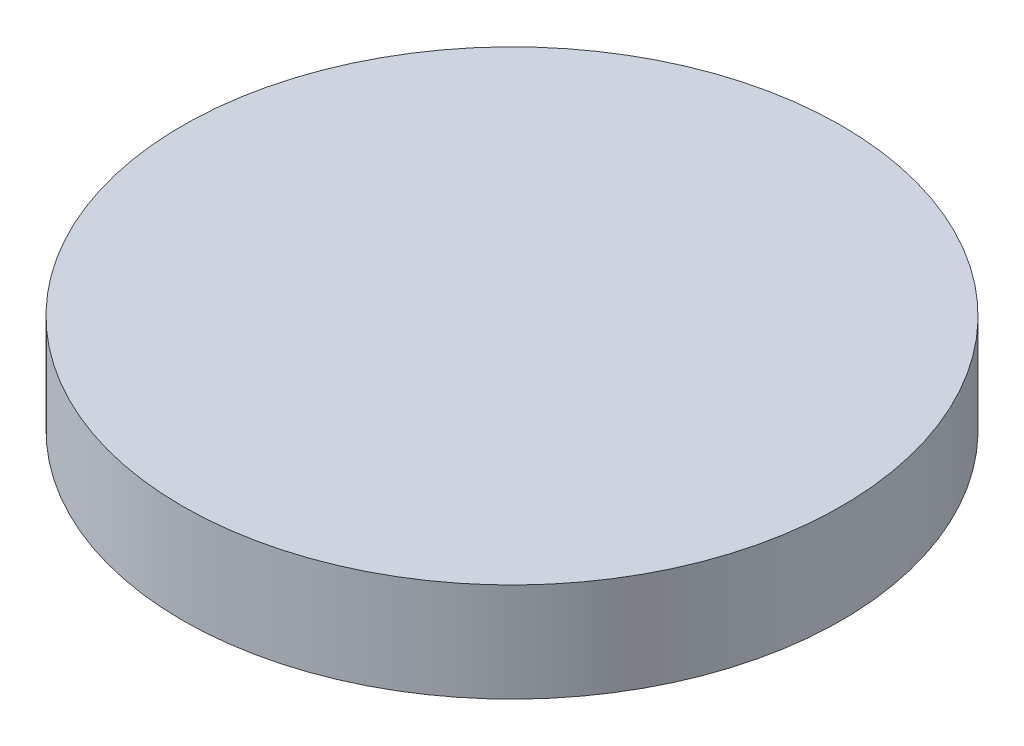
ISO-10303-21;
HEADER;
FILE_DESCRIPTION(('STEP AP214'),'2;1');
FILE_NAME('part.step','',(''),(''),'','','');
FILE_SCHEMA(('AUTOMOTIVE_DESIGN { 1 0 10303 214 1 1 1 1 }'));
ENDSEC;
DATA;
#1=APPLICATION_CONTEXT('core data for automotive mechanical design processes');
#2=APPLICATION_PROTOCOL_DEFINITION('international standard','automotive_design',2000,#1);
#3=PRODUCT_CONTEXT('',#1,'mechanical');
#4=PRODUCT('Part','Part','',(#3));
#5=PRODUCT_RELATED_PRODUCT_CATEGORY('part','',(#4));
#6=PRODUCT_DEFINITION_FORMATION('','',#4);
#7=PRODUCT_DEFINITION_CONTEXT('part definition',#1,'design');
#8=PRODUCT_DEFINITION('design','',#6,#7);
#9=PRODUCT_DEFINITION_SHAPE('','',#8);
#10=(LENGTH_UNIT() NAMED_UNIT(*) SI_UNIT(.MILLI.,.METRE.));
#11=(NAMED_UNIT(*) PLANE_ANGLE_UNIT() SI_UNIT($,.RADIAN.));
#12=(NAMED_UNIT(*) SI_UNIT($,.STERADIAN.) SOLID_ANGLE_UNIT());
#13=UNCERTAINTY_MEASURE_WITH_UNIT(LENGTH_MEASURE(1.E-05),#10,'distance_accuracy_value','');
#14=(GEOMETRIC_REPRESENTATION_CONTEXT(3) GLOBAL_UNCERTAINTY_ASSIGNED_CONTEXT((#13)) GLOBAL_UNIT_ASSIGNED_CONTEXT((#10,
#11,#12)) REPRESENTATION_CONTEXT('',''));
#15=CARTESIAN_POINT('',(0.,0.,0.));
#16=DIRECTION('',(0.,0.,1.));
#17=DIRECTION('',(1.,0.,0.));
#18=AXIS2_PLACEMENT_3D('',#15,#16,#17);
#19=CARTESIAN_POINT('',(0.,5.81153935626191,0.));
#20=DIRECTION('',(0.,-1.,0.));
#21=DIRECTION('',(0.,0.,-1.));
#22=AXIS2_PLACEMENT_3D('',#19,#20,#21);
#23=CYLINDRICAL_SURFACE('',#22,12.7);
#24=CARTESIAN_POINT('',(0.,5.81153935626191,0.));
#25=DIRECTION('',(0.,1.,0.));
#26=DIRECTION('',(0.,0.,1.));
#27=AXIS2_PLACEMENT_3D('',#24,#25,#26);
#28=CIRCLE('',#27,12.7);
#29=CARTESIAN_POINT('',(0.,5.81153935626191,12.7));
#30=VERTEX_POINT('',#29);
#31=EDGE_CURVE('E10',#30,#30,#28,.T.);
#32=ORIENTED_EDGE('',*,*,#31,.F.);
#33=EDGE_LOOP('',(#32));
#34=FACE_BOUND('',#33,.T.);
#35=CARTESIAN_POINT('',(0.,2.00153935626191,0.));
#36=DIRECTION('',(0.,1.,0.));
#37=DIRECTION('',(0.,0.,1.));
#38=AXIS2_PLACEMENT_3D('',#35,#36,#37);
#39=CIRCLE('',#38,12.7);
#40=CARTESIAN_POINT('',(0.,2.00153935626191,12.7));
#41=VERTEX_POINT('',#40);
#42=EDGE_CURVE('E44',#41,#41,#39,.T.);
#43=ORIENTED_EDGE('',*,*,#42,.T.);
#44=EDGE_LOOP('',(#43));
#45=FACE_BOUND('',#44,.T.);
#46=ADVANCED_FACE('F41',(#34,#45),#23,.T.);
#47=CARTESIAN_POINT('',(0.,5.81153935626191,0.));
#48=DIRECTION('',(0.,1.,0.));
#49=DIRECTION('',(0.,0.,1.));
#50=AXIS2_PLACEMENT_3D('',#47,#48,#49);
#51=PLANE('',#50);
#52=ORIENTED_EDGE('',*,*,#31,.T.);
#53=EDGE_LOOP('',(#52));
#54=FACE_BOUND('',#53,.T.);
#55=ADVANCED_FACE('F123',(#54),#51,.T.);
#56=CARTESIAN_POINT('',(0.,2.00153935626191,0.));
#57=DIRECTION('',(0.,1.,0.));
#58=DIRECTION('',(0.,0.,1.));
#59=AXIS2_PLACEMENT_3D('',#56,#57,#58);
#60=PLANE('',#59);
#61=CARTESIAN_POINT('',(0.,2.00153935626191,0.));
#62=DIRECTION('',(0.,1.,0.));
#63=DIRECTION('',(0.,0.,1.));
#64=AXIS2_PLACEMENT_3D('',#61,#62,#63);
#65=CIRCLE('',#64,2.413);
#66=CARTESIAN_POINT('',(0.,2.00153935626191,-2.413));
#67=VERTEX_POINT('',#66);
#68=EDGE_CURVE('E103',#67,#67,#65,.T.);
#69=ORIENTED_EDGE('',*,*,#68,.T.);
#70=EDGE_LOOP('',(#69));
#71=FACE_BOUND('',#70,.T.);
#72=CARTESIAN_POINT('',(-7.69896583964361,2.00153935626191,-4.44500000000009));
#73=DIRECTION('',(0.,1.,0.));
#74=DIRECTION('',(0.866025403784433,0.,0.50000000000001));
#75=AXIS2_PLACEMENT_3D('',#72,#73,#74);
#76=CIRCLE('',#75,2.413);
#77=CARTESIAN_POINT('',(-7.69896583964361,2.00153935626191,-6.85800000000009));
#78=VERTEX_POINT('',#77);
#79=EDGE_CURVE('E71',#78,#78,#76,.T.);
#80=ORIENTED_EDGE('',*,*,#79,.T.);
#81=EDGE_LOOP('',(#80));
#82=FACE_BOUND('',#81,.T.);
#83=CARTESIAN_POINT('',(-7.6989658396437,2.00153935626191,4.44499999999993));
#84=DIRECTION('',(0.,1.,0.));
#85=DIRECTION('',(0.866025403784443,0.,-0.499999999999992));
#86=AXIS2_PLACEMENT_3D('',#83,#84,#85);
#87=CIRCLE('',#86,2.413);
#88=CARTESIAN_POINT('',(-7.6989658396437,2.00153935626191,2.03199999999993));
#89=VERTEX_POINT('',#88);
#90=EDGE_CURVE('E80',#89,#89,#87,.T.);
#91=ORIENTED_EDGE('',*,*,#90,.T.);
#92=EDGE_LOOP('',(#91));
#93=FACE_BOUND('',#92,.T.);
#94=CARTESIAN_POINT('',(0.,2.00153935626191,8.89));
#95=DIRECTION('',(0.,1.,0.));
#96=DIRECTION('',(0.,0.,-1.));
#97=AXIS2_PLACEMENT_3D('',#94,#95,#96);
#98=CIRCLE('',#97,2.413);
#99=CARTESIAN_POINT('',(0.,2.00153935626191,6.477));
#100=VERTEX_POINT('',#99);
#101=EDGE_CURVE('E88',#100,#100,#98,.T.);
#102=ORIENTED_EDGE('',*,*,#101,.T.);
#103=EDGE_LOOP('',(#102));
#104=FACE_BOUND('',#103,.T.);
#105=CARTESIAN_POINT('',(7.69896583964364,2.00153935626191,4.44500000000004));
#106=DIRECTION('',(0.,1.,0.));
#107=DIRECTION('',(-0.866025403784436,0.,-0.500000000000004));
#108=AXIS2_PLACEMENT_3D('',#105,#106,#107);
#109=CIRCLE('',#108,2.413);
#110=CARTESIAN_POINT('',(7.69896583964364,2.00153935626191,2.03200000000004));
#111=VERTEX_POINT('',#110);
#112=EDGE_CURVE('E96',#111,#111,#109,.T.);
#113=ORIENTED_EDGE('',*,*,#112,.T.);
#114=EDGE_LOOP('',(#113));
#115=FACE_BOUND('',#114,.T.);
#116=CARTESIAN_POINT('',(7.69896583964367,2.00153935626191,-4.44499999999998));
#117=DIRECTION('',(0.,1.,0.));
#118=DIRECTION('',(-0.86602540378444,0.,0.499999999999998));
#119=AXIS2_PLACEMENT_3D('',#116,#117,#118);
#120=CIRCLE('',#119,2.413);
#121=CARTESIAN_POINT('',(7.69896583964367,2.00153935626191,-6.85799999999998));
#122=VERTEX_POINT('',#121);
#123=EDGE_CURVE('E63',#122,#122,#120,.T.);
#124=ORIENTED_EDGE('',*,*,#123,.T.);
#125=EDGE_LOOP('',(#124));
#126=FACE_BOUND('',#125,.T.);
#127=CARTESIAN_POINT('',(0.,2.00153935626191,-8.89));
#128=DIRECTION('',(0.,1.,0.));
#129=DIRECTION('',(0.,0.,1.));
#130=AXIS2_PLACEMENT_3D('',#127,#128,#129);
#131=CIRCLE('',#130,2.413);
#132=CARTESIAN_POINT('',(0.,2.00153935626191,-11.303));
#133=VERTEX_POINT('',#132);
#134=EDGE_CURVE('E55',#133,#133,#131,.T.);
#135=ORIENTED_EDGE('',*,*,#134,.T.);
#136=EDGE_LOOP('',(#135));
#137=FACE_BOUND('',#136,.T.);
#138=ORIENTED_EDGE('',*,*,#42,.F.);
#139=EDGE_LOOP('',(#138));
#140=FACE_BOUND('',#139,.T.);
#141=ADVANCED_FACE('F128',(#71,#82,#93,#104,#115,#126,#137,#140),#60,.F.);
#142=CARTESIAN_POINT('',(0.,5.04953935626191,-8.89));
#143=DIRECTION('',(0.,-1.,0.));
#144=DIRECTION('',(0.,0.,-1.));
#145=AXIS2_PLACEMENT_3D('',#142,#143,#144);
#146=CYLINDRICAL_SURFACE('',#145,2.413);
#147=CARTESIAN_POINT('',(0.,5.04953935626191,-8.89));
#148=DIRECTION('',(0.,1.,0.));
#149=DIRECTION('',(0.,0.,1.));
#150=AXIS2_PLACEMENT_3D('',#147,#148,#149);
#151=CIRCLE('',#150,2.413);
#152=CARTESIAN_POINT('',(0.,5.04953935626191,-11.303));
#153=VERTEX_POINT('',#152);
#154=EDGE_CURVE('E53',#153,#153,#151,.T.);
#155=CARTESIAN_POINT('',(0.,5.04953935626191,-11.303));
#156=CARTESIAN_POINT('',(0.,5.01778935626191,-11.303));
#157=CARTESIAN_POINT('',(0.,4.98603935626191,-11.303));
#158=CARTESIAN_POINT('',(0.,4.92253935626191,-11.303));
#159=CARTESIAN_POINT('',(0.,4.89078935626191,-11.303));
#160=CARTESIAN_POINT('',(0.,4.82728935626191,-11.303));
#161=CARTESIAN_POINT('',(0.,4.79553935626191,-11.303));
#162=CARTESIAN_POINT('',(0.,4.73203935626191,-11.303));
#163=CARTESIAN_POINT('',(0.,4.70028935626191,-11.303));
#164=CARTESIAN_POINT('',(0.,4.63678935626191,-11.303));
#165=CARTESIAN_POINT('',(0.,4.60503935626191,-11.303));
#166=CARTESIAN_POINT('',(0.,4.54153935626191,-11.303));
#167=CARTESIAN_POINT('',(0.,4.50978935626191,-11.303));
#168=CARTESIAN_POINT('',(0.,4.44628935626191,-11.303));
#169=CARTESIAN_POINT('',(0.,4.41453935626191,-11.303));
#170=CARTESIAN_POINT('',(0.,4.35103935626191,-11.303));
#171=CARTESIAN_POINT('',(0.,4.31928935626191,-11.303));
#172=CARTESIAN_POINT('',(0.,4.25578935626191,-11.303));
#173=CARTESIAN_POINT('',(0.,4.22403935626191,-11.303));
#174=CARTESIAN_POINT('',(0.,4.16053935626191,-11.303));
#175=CARTESIAN_POINT('',(0.,4.12878935626191,-11.303));
#176=CARTESIAN_POINT('',(0.,4.06528935626191,-11.303));
#177=CARTESIAN_POINT('',(0.,4.03353935626191,-11.303));
#178=CARTESIAN_POINT('',(0.,3.97003935626191,-11.303));
#179=CARTESIAN_POINT('',(0.,3.93828935626191,-11.303));
#180=CARTESIAN_POINT('',(0.,3.87478935626191,-11.303));
#181=CARTESIAN_POINT('',(0.,3.84303935626191,-11.303));
#182=CARTESIAN_POINT('',(0.,3.77953935626191,-11.303));
#183=CARTESIAN_POINT('',(0.,3.74778935626191,-11.303));
#184=CARTESIAN_POINT('',(0.,3.68428935626191,-11.303));
#185=CARTESIAN_POINT('',(0.,3.65253935626191,-11.303));
#186=CARTESIAN_POINT('',(0.,3.58903935626191,-11.303));
#187=CARTESIAN_POINT('',(0.,3.55728935626191,-11.303));
#188=CARTESIAN_POINT('',(0.,3.49378935626191,-11.303));
#189=CARTESIAN_POINT('',(0.,3.46203935626191,-11.303));
#190=CARTESIAN_POINT('',(0.,3.39853935626191,-11.303));
#191=CARTESIAN_POINT('',(0.,3.36678935626191,-11.303));
#192=CARTESIAN_POINT('',(0.,3.30328935626191,-11.303));
#193=CARTESIAN_POINT('',(0.,3.27153935626191,-11.303));
#194=CARTESIAN_POINT('',(0.,3.20803935626191,-11.303));
#195=CARTESIAN_POINT('',(0.,3.17628935626191,-11.303));
#196=CARTESIAN_POINT('',(0.,3.11278935626191,-11.303));
#197=CARTESIAN_POINT('',(0.,3.08103935626191,-11.303));
#198=CARTESIAN_POINT('',(0.,3.01753935626191,-11.303));
#199=CARTESIAN_POINT('',(0.,2.98578935626191,-11.303));
#200=CARTESIAN_POINT('',(0.,2.92228935626191,-11.303));
#201=CARTESIAN_POINT('',(0.,2.89053935626191,-11.303));
#202=CARTESIAN_POINT('',(0.,2.82703935626191,-11.303));
#203=CARTESIAN_POINT('',(0.,2.79528935626191,-11.303));
#204=CARTESIAN_POINT('',(0.,2.73178935626191,-11.303));
#205=CARTESIAN_POINT('',(0.,2.70003935626191,-11.303));
#206=CARTESIAN_POINT('',(0.,2.63653935626191,-11.303));
#207=CARTESIAN_POINT('',(0.,2.60478935626191,-11.303));
#208=CARTESIAN_POINT('',(0.,2.54128935626191,-11.303));
#209=CARTESIAN_POINT('',(0.,2.50953935626191,-11.303));
#210=CARTESIAN_POINT('',(0.,2.44603935626191,-11.303));
#211=CARTESIAN_POINT('',(0.,2.41428935626191,-11.303));
#212=CARTESIAN_POINT('',(0.,2.35078935626191,-11.303));
#213=CARTESIAN_POINT('',(0.,2.31903935626191,-11.303));
#214=CARTESIAN_POINT('',(0.,2.25553935626191,-11.303));
#215=CARTESIAN_POINT('',(0.,2.22378935626191,-11.303));
#216=CARTESIAN_POINT('',(0.,2.16028935626191,-11.303));
#217=CARTESIAN_POINT('',(0.,2.12853935626191,-11.303));
#218=CARTESIAN_POINT('',(0.,2.06503935626191,-11.303));
#219=CARTESIAN_POINT('',(0.,2.03328935626191,-11.303));
#220=CARTESIAN_POINT('',(0.,2.00153935626191,-11.303));
#221=B_SPLINE_CURVE_WITH_KNOTS('',3,(#155,#156,#157,#158,#159,#160,#161,#162,#163,#164,#165,
#166,#167,#168,#169,#170,#171,#172,#173,#174,#175,#176,#177,#178,#179,#180,#181,#182,#183,#184,
#185,#186,#187,#188,#189,#190,#191,#192,#193,#194,#195,#196,#197,#198,#199,#200,#201,#202,#203,
#204,#205,#206,#207,#208,#209,#210,#211,#212,#213,#214,#215,#216,#217,#218,#219,#220),
.UNSPECIFIED.,.F.,.F.,(4,2,2,2,2,2,2,2,2,2,2,2,2,2,2,2,2,2,2,2,2,2,2,2,2,2,2,2,2,2,2,2,4),(0.,
0.0952499999999998,0.1905,0.28575,0.380999999999999,0.476249999999999,0.571499999999999,0.66675,
0.762,0.85725,0.952499999999999,1.04775,1.143,1.23825,1.3335,1.42875,1.524,1.61925,1.7145,
1.80975,1.905,2.00025,2.0955,2.19075,2.286,2.38125,2.4765,2.57175,2.667,2.76225,2.8575,2.95275,
3.048),.UNSPECIFIED.);
#222=EDGE_CURVE('BSEAM134',#153,#133,#221,.T.);
#223=ORIENTED_EDGE('',*,*,#154,.T.);
#224=ORIENTED_EDGE('',*,*,#134,.F.);
#225=ORIENTED_EDGE('',*,*,#222,.T.);
#226=ORIENTED_EDGE('',*,*,#222,.F.);
#227=EDGE_LOOP('',(#223,#225,#224,#226));
#228=FACE_BOUND('',#227,.T.);
#229=ADVANCED_FACE('F134',(#228),#146,.F.);
#230=CARTESIAN_POINT('',(0.,5.04953935626191,-8.89));
#231=DIRECTION('',(0.,1.,0.));
#232=DIRECTION('',(0.,0.,1.));
#233=AXIS2_PLACEMENT_3D('',#230,#231,#232);
#234=PLANE('',#233);
#235=ORIENTED_EDGE('',*,*,#154,.F.);
#236=EDGE_LOOP('',(#235));
#237=FACE_BOUND('',#236,.T.);
#238=ADVANCED_FACE('F139',(#237),#234,.F.);
#239=CARTESIAN_POINT('',(7.69896583964367,5.04953935626191,-4.44499999999998));
#240=DIRECTION('',(0.,-1.,0.));
#241=DIRECTION('',(0.,0.,-1.));
#242=AXIS2_PLACEMENT_3D('',#239,#240,#241);
#243=CYLINDRICAL_SURFACE('',#242,2.413);
#244=CARTESIAN_POINT('',(7.69896583964367,5.04953935626191,-4.44499999999998));
#245=DIRECTION('',(0.,1.,0.));
#246=DIRECTION('',(-0.86602540378444,0.,0.499999999999998));
#247=AXIS2_PLACEMENT_3D('',#244,#245,#246);
#248=CIRCLE('',#247,2.413);
#249=CARTESIAN_POINT('',(7.69896583964367,5.04953935626191,-6.85799999999998));
#250=VERTEX_POINT('',#249);
#251=EDGE_CURVE('E59',#250,#250,#248,.T.);
#252=CARTESIAN_POINT('',(7.69896583964367,5.04953935626191,-6.85799999999998));
#253=CARTESIAN_POINT('',(7.69896583964367,5.01778935626191,-6.85799999999998));
#254=CARTESIAN_POINT('',(7.69896583964367,4.98603935626191,-6.85799999999998));
#255=CARTESIAN_POINT('',(7.69896583964367,4.92253935626191,-6.85799999999998));
#256=CARTESIAN_POINT('',(7.69896583964367,4.89078935626191,-6.85799999999998));
#257=CARTESIAN_POINT('',(7.69896583964367,4.82728935626191,-6.85799999999998));
#258=CARTESIAN_POINT('',(7.69896583964367,4.79553935626191,-6.85799999999998));
#259=CARTESIAN_POINT('',(7.69896583964367,4.73203935626191,-6.85799999999998));
#260=CARTESIAN_POINT('',(7.69896583964367,4.70028935626191,-6.85799999999998));
#261=CARTESIAN_POINT('',(7.69896583964367,4.63678935626191,-6.85799999999998));
#262=CARTESIAN_POINT('',(7.69896583964367,4.60503935626191,-6.85799999999998));
#263=CARTESIAN_POINT('',(7.69896583964367,4.54153935626191,-6.85799999999998));
#264=CARTESIAN_POINT('',(7.69896583964367,4.50978935626191,-6.85799999999998));
#265=CARTESIAN_POINT('',(7.69896583964367,4.44628935626191,-6.85799999999998));
#266=CARTESIAN_POINT('',(7.69896583964367,4.41453935626191,-6.85799999999998));
#267=CARTESIAN_POINT('',(7.69896583964367,4.35103935626191,-6.85799999999998));
#268=CARTESIAN_POINT('',(7.69896583964367,4.31928935626191,-6.85799999999998));
#269=CARTESIAN_POINT('',(7.69896583964367,4.25578935626191,-6.85799999999998));
#270=CARTESIAN_POINT('',(7.69896583964367,4.22403935626191,-6.85799999999998));
#271=CARTESIAN_POINT('',(7.69896583964367,4.16053935626191,-6.85799999999998));
#272=CARTESIAN_POINT('',(7.69896583964367,4.12878935626191,-6.85799999999998));
#273=CARTESIAN_POINT('',(7.69896583964367,4.06528935626191,-6.85799999999998));
#274=CARTESIAN_POINT('',(7.69896583964367,4.03353935626191,-6.85799999999998));
#275=CARTESIAN_POINT('',(7.69896583964367,3.97003935626191,-6.85799999999998));
#276=CARTESIAN_POINT('',(7.69896583964367,3.93828935626191,-6.85799999999998));
#277=CARTESIAN_POINT('',(7.69896583964367,3.87478935626191,-6.85799999999998));
#278=CARTESIAN_POINT('',(7.69896583964367,3.84303935626191,-6.85799999999998));
#279=CARTESIAN_POINT('',(7.69896583964367,3.77953935626191,-6.85799999999998));
#280=CARTESIAN_POINT('',(7.69896583964367,3.74778935626191,-6.85799999999998));
#281=CARTESIAN_POINT('',(7.69896583964367,3.68428935626191,-6.85799999999998));
#282=CARTESIAN_POINT('',(7.69896583964367,3.65253935626191,-6.85799999999998));
#283=CARTESIAN_POINT('',(7.69896583964367,3.58903935626191,-6.85799999999998));
#284=CARTESIAN_POINT('',(7.69896583964367,3.55728935626191,-6.85799999999998));
#285=CARTESIAN_POINT('',(7.69896583964367,3.49378935626191,-6.85799999999998));
#286=CARTESIAN_POINT('',(7.69896583964367,3.46203935626191,-6.85799999999998));
#287=CARTESIAN_POINT('',(7.69896583964367,3.39853935626191,-6.85799999999998));
#288=CARTESIAN_POINT('',(7.69896583964367,3.36678935626191,-6.85799999999998));
#289=CARTESIAN_POINT('',(7.69896583964367,3.30328935626191,-6.85799999999998));
#290=CARTESIAN_POINT('',(7.69896583964367,3.27153935626191,-6.85799999999998));
#291=CARTESIAN_POINT('',(7.69896583964367,3.20803935626191,-6.85799999999998));
#292=CARTESIAN_POINT('',(7.69896583964367,3.17628935626191,-6.85799999999998));
#293=CARTESIAN_POINT('',(7.69896583964367,3.11278935626191,-6.85799999999998));
#294=CARTESIAN_POINT('',(7.69896583964367,3.08103935626191,-6.85799999999998));
#295=CARTESIAN_POINT('',(7.69896583964367,3.01753935626191,-6.85799999999998));
#296=CARTESIAN_POINT('',(7.69896583964367,2.98578935626191,-6.85799999999998));
#297=CARTESIAN_POINT('',(7.69896583964367,2.92228935626191,-6.85799999999998));
#298=CARTESIAN_POINT('',(7.69896583964367,2.89053935626191,-6.85799999999998));
#299=CARTESIAN_POINT('',(7.69896583964367,2.82703935626191,-6.85799999999998));
#300=CARTESIAN_POINT('',(7.69896583964367,2.79528935626191,-6.85799999999998));
#301=CARTESIAN_POINT('',(7.69896583964367,2.73178935626191,-6.85799999999998));
#302=CARTESIAN_POINT('',(7.69896583964367,2.70003935626191,-6.85799999999998));
#303=CARTESIAN_POINT('',(7.69896583964367,2.63653935626191,-6.85799999999998));
#304=CARTESIAN_POINT('',(7.69896583964367,2.60478935626191,-6.85799999999998));
#305=CARTESIAN_POINT('',(7.69896583964367,2.54128935626191,-6.85799999999998));
#306=CARTESIAN_POINT('',(7.69896583964367,2.50953935626191,-6.85799999999998));
#307=CARTESIAN_POINT('',(7.69896583964367,2.44603935626191,-6.85799999999998));
#308=CARTESIAN_POINT('',(7.69896583964367,2.41428935626191,-6.85799999999998));
#309=CARTESIAN_POINT('',(7.69896583964367,2.35078935626191,-6.85799999999998));
#310=CARTESIAN_POINT('',(7.69896583964367,2.31903935626191,-6.85799999999998));
#311=CARTESIAN_POINT('',(7.69896583964367,2.25553935626191,-6.85799999999998));
#312=CARTESIAN_POINT('',(7.69896583964367,2.22378935626191,-6.85799999999998));
#313=CARTESIAN_POINT('',(7.69896583964367,2.16028935626191,-6.85799999999998));
#314=CARTESIAN_POINT('',(7.69896583964367,2.12853935626191,-6.85799999999998));
#315=CARTESIAN_POINT('',(7.69896583964367,2.06503935626191,-6.85799999999998));
#316=CARTESIAN_POINT('',(7.69896583964367,2.03328935626191,-6.85799999999998));
#317=CARTESIAN_POINT('',(7.69896583964367,2.00153935626191,-6.85799999999998));
#318=B_SPLINE_CURVE_WITH_KNOTS('',3,(#252,#253,#254,#255,#256,#257,#258,#259,#260,#261,#262,
#263,#264,#265,#266,#267,#268,#269,#270,#271,#272,#273,#274,#275,#276,#277,#278,#279,#280,#281,
#282,#283,#284,#285,#286,#287,#288,#289,#290,#291,#292,#293,#294,#295,#296,#297,#298,#299,#300,
#301,#302,#303,#304,#305,#306,#307,#308,#309,#310,#311,#312,#313,#314,#315,#316,#317),
.UNSPECIFIED.,.F.,.F.,(4,2,2,2,2,2,2,2,2,2,2,2,2,2,2,2,2,2,2,2,2,2,2,2,2,2,2,2,2,2,2,2,4),(0.,
0.0952499999999998,0.1905,0.28575,0.380999999999999,0.476249999999999,0.571499999999999,0.66675,
0.762,0.85725,0.952499999999999,1.04775,1.143,1.23825,1.3335,1.42875,1.524,1.61925,1.7145,
1.80975,1.905,2.00025,2.0955,2.19075,2.286,2.38125,2.4765,2.57175,2.667,2.76225,2.8575,2.95275,
3.048),.UNSPECIFIED.);
#319=EDGE_CURVE('BSEAM146',#250,#122,#318,.T.);
#320=ORIENTED_EDGE('',*,*,#251,.T.);
#321=ORIENTED_EDGE('',*,*,#123,.F.);
#322=ORIENTED_EDGE('',*,*,#319,.T.);
#323=ORIENTED_EDGE('',*,*,#319,.F.);
#324=EDGE_LOOP('',(#320,#322,#321,#323));
#325=FACE_BOUND('',#324,.T.);
#326=ADVANCED_FACE('F146',(#325),#243,.F.);
#327=CARTESIAN_POINT('',(7.69896583964367,5.04953935626191,-4.44499999999998));
#328=DIRECTION('',(0.,1.,0.));
#329=DIRECTION('',(-0.86602540378444,0.,0.499999999999998));
#330=AXIS2_PLACEMENT_3D('',#327,#328,#329);
#331=PLANE('',#330);
#332=ORIENTED_EDGE('',*,*,#251,.F.);
#333=EDGE_LOOP('',(#332));
#334=FACE_BOUND('',#333,.T.);
#335=ADVANCED_FACE('F150',(#334),#331,.F.);
#336=CARTESIAN_POINT('',(7.69896583964364,5.04953935626191,4.44500000000004));
#337=DIRECTION('',(0.,-1.,0.));
#338=DIRECTION('',(0.,0.,-1.));
#339=AXIS2_PLACEMENT_3D('',#336,#337,#338);
#340=CYLINDRICAL_SURFACE('',#339,2.413);
#341=CARTESIAN_POINT('',(7.69896583964364,5.04953935626191,4.44500000000004));
#342=DIRECTION('',(0.,1.,0.));
#343=DIRECTION('',(-0.866025403784436,0.,-0.500000000000004));
#344=AXIS2_PLACEMENT_3D('',#341,#342,#343);
#345=CIRCLE('',#344,2.413);
#346=CARTESIAN_POINT('',(7.69896583964364,5.04953935626191,2.03200000000004));
#347=VERTEX_POINT('',#346);
#348=EDGE_CURVE('E67',#347,#347,#345,.T.);
#349=CARTESIAN_POINT('',(7.69896583964364,5.04953935626191,2.03200000000004));
#350=CARTESIAN_POINT('',(7.69896583964364,5.01778935626191,2.03200000000004));
#351=CARTESIAN_POINT('',(7.69896583964364,4.98603935626191,2.03200000000004));
#352=CARTESIAN_POINT('',(7.69896583964364,4.92253935626191,2.03200000000004));
#353=CARTESIAN_POINT('',(7.69896583964364,4.89078935626191,2.03200000000004));
#354=CARTESIAN_POINT('',(7.69896583964364,4.82728935626191,2.03200000000004));
#355=CARTESIAN_POINT('',(7.69896583964364,4.79553935626191,2.03200000000004));
#356=CARTESIAN_POINT('',(7.69896583964364,4.73203935626191,2.03200000000004));
#357=CARTESIAN_POINT('',(7.69896583964364,4.70028935626191,2.03200000000004));
#358=CARTESIAN_POINT('',(7.69896583964364,4.63678935626191,2.03200000000004));
#359=CARTESIAN_POINT('',(7.69896583964364,4.60503935626191,2.03200000000004));
#360=CARTESIAN_POINT('',(7.69896583964364,4.54153935626191,2.03200000000004));
#361=CARTESIAN_POINT('',(7.69896583964364,4.50978935626191,2.03200000000004));
#362=CARTESIAN_POINT('',(7.69896583964364,4.44628935626191,2.03200000000004));
#363=CARTESIAN_POINT('',(7.69896583964364,4.41453935626191,2.03200000000004));
#364=CARTESIAN_POINT('',(7.69896583964364,4.35103935626191,2.03200000000004));
#365=CARTESIAN_POINT('',(7.69896583964364,4.31928935626191,2.03200000000004));
#366=CARTESIAN_POINT('',(7.69896583964364,4.25578935626191,2.03200000000004));
#367=CARTESIAN_POINT('',(7.69896583964364,4.22403935626191,2.03200000000004));
#368=CARTESIAN_POINT('',(7.69896583964364,4.16053935626191,2.03200000000004));
#369=CARTESIAN_POINT('',(7.69896583964364,4.12878935626191,2.03200000000004));
#370=CARTESIAN_POINT('',(7.69896583964364,4.06528935626191,2.03200000000004));
#371=CARTESIAN_POINT('',(7.69896583964364,4.03353935626191,2.03200000000004));
#372=CARTESIAN_POINT('',(7.69896583964364,3.97003935626191,2.03200000000004));
#373=CARTESIAN_POINT('',(7.69896583964364,3.93828935626191,2.03200000000004));
#374=CARTESIAN_POINT('',(7.69896583964364,3.87478935626191,2.03200000000004));
#375=CARTESIAN_POINT('',(7.69896583964364,3.84303935626191,2.03200000000004));
#376=CARTESIAN_POINT('',(7.69896583964364,3.77953935626191,2.03200000000004));
#377=CARTESIAN_POINT('',(7.69896583964364,3.74778935626191,2.03200000000004));
#378=CARTESIAN_POINT('',(7.69896583964364,3.68428935626191,2.03200000000004));
#379=CARTESIAN_POINT('',(7.69896583964364,3.65253935626191,2.03200000000004));
#380=CARTESIAN_POINT('',(7.69896583964364,3.58903935626191,2.03200000000004));
#381=CARTESIAN_POINT('',(7.69896583964364,3.55728935626191,2.03200000000004));
#382=CARTESIAN_POINT('',(7.69896583964364,3.49378935626191,2.03200000000004));
#383=CARTESIAN_POINT('',(7.69896583964364,3.46203935626191,2.03200000000004));
#384=CARTESIAN_POINT('',(7.69896583964364,3.39853935626191,2.03200000000004));
#385=CARTESIAN_POINT('',(7.69896583964364,3.36678935626191,2.03200000000004));
#386=CARTESIAN_POINT('',(7.69896583964364,3.30328935626191,2.03200000000004));
#387=CARTESIAN_POINT('',(7.69896583964364,3.27153935626191,2.03200000000004));
#388=CARTESIAN_POINT('',(7.69896583964364,3.20803935626191,2.03200000000004));
#389=CARTESIAN_POINT('',(7.69896583964364,3.17628935626191,2.03200000000004));
#390=CARTESIAN_POINT('',(7.69896583964364,3.11278935626191,2.03200000000004));
#391=CARTESIAN_POINT('',(7.69896583964364,3.08103935626191,2.03200000000004));
#392=CARTESIAN_POINT('',(7.69896583964364,3.01753935626191,2.03200000000004));
#393=CARTESIAN_POINT('',(7.69896583964364,2.98578935626191,2.03200000000004));
#394=CARTESIAN_POINT('',(7.69896583964364,2.92228935626191,2.03200000000004));
#395=CARTESIAN_POINT('',(7.69896583964364,2.89053935626191,2.03200000000004));
#396=CARTESIAN_POINT('',(7.69896583964364,2.82703935626191,2.03200000000004));
#397=CARTESIAN_POINT('',(7.69896583964364,2.79528935626191,2.03200000000004));
#398=CARTESIAN_POINT('',(7.69896583964364,2.73178935626191,2.03200000000004));
#399=CARTESIAN_POINT('',(7.69896583964364,2.70003935626191,2.03200000000004));
#400=CARTESIAN_POINT('',(7.69896583964364,2.63653935626191,2.03200000000004));
#401=CARTESIAN_POINT('',(7.69896583964364,2.60478935626191,2.03200000000004));
#402=CARTESIAN_POINT('',(7.69896583964364,2.54128935626191,2.03200000000004));
#403=CARTESIAN_POINT('',(7.69896583964364,2.50953935626191,2.03200000000004));
#404=CARTESIAN_POINT('',(7.69896583964364,2.44603935626191,2.03200000000004));
#405=CARTESIAN_POINT('',(7.69896583964364,2.41428935626191,2.03200000000004));
#406=CARTESIAN_POINT('',(7.69896583964364,2.35078935626191,2.03200000000004));
#407=CARTESIAN_POINT('',(7.69896583964364,2.31903935626191,2.03200000000004));
#408=CARTESIAN_POINT('',(7.69896583964364,2.25553935626191,2.03200000000004));
#409=CARTESIAN_POINT('',(7.69896583964364,2.22378935626191,2.03200000000004));
#410=CARTESIAN_POINT('',(7.69896583964364,2.16028935626191,2.03200000000004));
#411=CARTESIAN_POINT('',(7.69896583964364,2.12853935626191,2.03200000000004));
#412=CARTESIAN_POINT('',(7.69896583964364,2.06503935626191,2.03200000000004));
#413=CARTESIAN_POINT('',(7.69896583964364,2.03328935626191,2.03200000000004));
#414=CARTESIAN_POINT('',(7.69896583964364,2.00153935626191,2.03200000000004));
#415=B_SPLINE_CURVE_WITH_KNOTS('',3,(#349,#350,#351,#352,#353,#354,#355,#356,#357,#358,#359,
#360,#361,#362,#363,#364,#365,#366,#367,#368,#369,#370,#371,#372,#373,#374,#375,#376,#377,#378,
#379,#380,#381,#382,#383,#384,#385,#386,#387,#388,#389,#390,#391,#392,#393,#394,#395,#396,#397,
#398,#399,#400,#401,#402,#403,#404,#405,#406,#407,#408,#409,#410,#411,#412,#413,#414),
.UNSPECIFIED.,.F.,.F.,(4,2,2,2,2,2,2,2,2,2,2,2,2,2,2,2,2,2,2,2,2,2,2,2,2,2,2,2,2,2,2,2,4),(0.,
0.0952499999999998,0.1905,0.28575,0.380999999999999,0.476249999999999,0.571499999999999,0.66675,
0.762,0.85725,0.952499999999999,1.04775,1.143,1.23825,1.3335,1.42875,1.524,1.61925,1.7145,
1.80975,1.905,2.00025,2.0955,2.19075,2.286,2.38125,2.4765,2.57175,2.667,2.76225,2.8575,2.95275,
3.048),.UNSPECIFIED.);
#416=EDGE_CURVE('BSEAM154',#347,#111,#415,.T.);
#417=ORIENTED_EDGE('',*,*,#348,.T.);
#418=ORIENTED_EDGE('',*,*,#112,.F.);
#419=ORIENTED_EDGE('',*,*,#416,.T.);
#420=ORIENTED_EDGE('',*,*,#416,.F.);
#421=EDGE_LOOP('',(#417,#419,#418,#420));
#422=FACE_BOUND('',#421,.T.);
#423=ADVANCED_FACE('F154',(#422),#340,.F.);
#424=CARTESIAN_POINT('',(7.69896583964364,5.04953935626191,4.44500000000004));
#425=DIRECTION('',(0.,1.,0.));
#426=DIRECTION('',(-0.866025403784436,0.,-0.500000000000004));
#427=AXIS2_PLACEMENT_3D('',#424,#425,#426);
#428=PLANE('',#427);
#429=ORIENTED_EDGE('',*,*,#348,.F.);
#430=EDGE_LOOP('',(#429));
#431=FACE_BOUND('',#430,.T.);
#432=ADVANCED_FACE('F175',(#431),#428,.F.);
#433=CARTESIAN_POINT('',(0.,5.04953935626191,8.89));
#434=DIRECTION('',(0.,-1.,0.));
#435=DIRECTION('',(0.,0.,-1.));
#436=AXIS2_PLACEMENT_3D('',#433,#434,#435);
#437=CYLINDRICAL_SURFACE('',#436,2.413);
#438=CARTESIAN_POINT('',(0.,5.04953935626191,8.89));
#439=DIRECTION('',(0.,1.,0.));
#440=DIRECTION('',(0.,0.,-1.));
#441=AXIS2_PLACEMENT_3D('',#438,#439,#440);
#442=CIRCLE('',#441,2.413);
#443=CARTESIAN_POINT('',(0.,5.04953935626191,6.477));
#444=VERTEX_POINT('',#443);
#445=EDGE_CURVE('E92',#444,#444,#442,.T.);
#446=CARTESIAN_POINT('',(0.,5.04953935626191,6.477));
#447=CARTESIAN_POINT('',(0.,5.01778935626191,6.477));
#448=CARTESIAN_POINT('',(0.,4.98603935626191,6.477));
#449=CARTESIAN_POINT('',(0.,4.92253935626191,6.477));
#450=CARTESIAN_POINT('',(0.,4.89078935626191,6.477));
#451=CARTESIAN_POINT('',(0.,4.82728935626191,6.477));
#452=CARTESIAN_POINT('',(0.,4.79553935626191,6.477));
#453=CARTESIAN_POINT('',(0.,4.73203935626191,6.477));
#454=CARTESIAN_POINT('',(0.,4.70028935626191,6.477));
#455=CARTESIAN_POINT('',(0.,4.63678935626191,6.477));
#456=CARTESIAN_POINT('',(0.,4.60503935626191,6.477));
#457=CARTESIAN_POINT('',(0.,4.54153935626191,6.477));
#458=CARTESIAN_POINT('',(0.,4.50978935626191,6.477));
#459=CARTESIAN_POINT('',(0.,4.44628935626191,6.477));
#460=CARTESIAN_POINT('',(0.,4.41453935626191,6.477));
#461=CARTESIAN_POINT('',(0.,4.35103935626191,6.477));
#462=CARTESIAN_POINT('',(0.,4.31928935626191,6.477));
#463=CARTESIAN_POINT('',(0.,4.25578935626191,6.477));
#464=CARTESIAN_POINT('',(0.,4.22403935626191,6.477));
#465=CARTESIAN_POINT('',(0.,4.16053935626191,6.477));
#466=CARTESIAN_POINT('',(0.,4.12878935626191,6.477));
#467=CARTESIAN_POINT('',(0.,4.06528935626191,6.477));
#468=CARTESIAN_POINT('',(0.,4.03353935626191,6.477));
#469=CARTESIAN_POINT('',(0.,3.97003935626191,6.477));
#470=CARTESIAN_POINT('',(0.,3.93828935626191,6.477));
#471=CARTESIAN_POINT('',(0.,3.87478935626191,6.477));
#472=CARTESIAN_POINT('',(0.,3.84303935626191,6.477));
#473=CARTESIAN_POINT('',(0.,3.77953935626191,6.477));
#474=CARTESIAN_POINT('',(0.,3.74778935626191,6.477));
#475=CARTESIAN_POINT('',(0.,3.68428935626191,6.477));
#476=CARTESIAN_POINT('',(0.,3.65253935626191,6.477));
#477=CARTESIAN_POINT('',(0.,3.58903935626191,6.477));
#478=CARTESIAN_POINT('',(0.,3.55728935626191,6.477));
#479=CARTESIAN_POINT('',(0.,3.49378935626191,6.477));
#480=CARTESIAN_POINT('',(0.,3.46203935626191,6.477));
#481=CARTESIAN_POINT('',(0.,3.39853935626191,6.477));
#482=CARTESIAN_POINT('',(0.,3.36678935626191,6.477));
#483=CARTESIAN_POINT('',(0.,3.30328935626191,6.477));
#484=CARTESIAN_POINT('',(0.,3.27153935626191,6.477));
#485=CARTESIAN_POINT('',(0.,3.20803935626191,6.477));
#486=CARTESIAN_POINT('',(0.,3.17628935626191,6.477));
#487=CARTESIAN_POINT('',(0.,3.11278935626191,6.477));
#488=CARTESIAN_POINT('',(0.,3.08103935626191,6.477));
#489=CARTESIAN_POINT('',(0.,3.01753935626191,6.477));
#490=CARTESIAN_POINT('',(0.,2.98578935626191,6.477));
#491=CARTESIAN_POINT('',(0.,2.92228935626191,6.477));
#492=CARTESIAN_POINT('',(0.,2.89053935626191,6.477));
#493=CARTESIAN_POINT('',(0.,2.82703935626191,6.477));
#494=CARTESIAN_POINT('',(0.,2.79528935626191,6.477));
#495=CARTESIAN_POINT('',(0.,2.73178935626191,6.477));
#496=CARTESIAN_POINT('',(0.,2.70003935626191,6.477));
#497=CARTESIAN_POINT('',(0.,2.63653935626191,6.477));
#498=CARTESIAN_POINT('',(0.,2.60478935626191,6.477));
#499=CARTESIAN_POINT('',(0.,2.54128935626191,6.477));
#500=CARTESIAN_POINT('',(0.,2.50953935626191,6.477));
#501=CARTESIAN_POINT('',(0.,2.44603935626191,6.477));
#502=CARTESIAN_POINT('',(0.,2.41428935626191,6.477));
#503=CARTESIAN_POINT('',(0.,2.35078935626191,6.477));
#504=CARTESIAN_POINT('',(0.,2.31903935626191,6.477));
#505=CARTESIAN_POINT('',(0.,2.25553935626191,6.477));
#506=CARTESIAN_POINT('',(0.,2.22378935626191,6.477));
#507=CARTESIAN_POINT('',(0.,2.16028935626191,6.477));
#508=CARTESIAN_POINT('',(0.,2.12853935626191,6.477));
#509=CARTESIAN_POINT('',(0.,2.06503935626191,6.477));
#510=CARTESIAN_POINT('',(0.,2.03328935626191,6.477));
#511=CARTESIAN_POINT('',(0.,2.00153935626191,6.477));
#512=B_SPLINE_CURVE_WITH_KNOTS('',3,(#446,#447,#448,#449,#450,#451,#452,#453,#454,#455,#456,
#457,#458,#459,#460,#461,#462,#463,#464,#465,#466,#467,#468,#469,#470,#471,#472,#473,#474,#475,
#476,#477,#478,#479,#480,#481,#482,#483,#484,#485,#486,#487,#488,#489,#490,#491,#492,#493,#494,
#495,#496,#497,#498,#499,#500,#501,#502,#503,#504,#505,#506,#507,#508,#509,#510,#511),
.UNSPECIFIED.,.F.,.F.,(4,2,2,2,2,2,2,2,2,2,2,2,2,2,2,2,2,2,2,2,2,2,2,2,2,2,2,2,2,2,2,2,4),(0.,
0.0952499999999998,0.1905,0.28575,0.380999999999999,0.476249999999999,0.571499999999999,0.66675,
0.762,0.85725,0.952499999999999,1.04775,1.143,1.23825,1.3335,1.42875,1.524,1.61925,1.7145,
1.80975,1.905,2.00025,2.0955,2.19075,2.286,2.38125,2.4765,2.57175,2.667,2.76225,2.8575,2.95275,
3.048),.UNSPECIFIED.);
#513=EDGE_CURVE('BSEAM172',#444,#100,#512,.T.);
#514=ORIENTED_EDGE('',*,*,#445,.T.);
#515=ORIENTED_EDGE('',*,*,#101,.F.);
#516=ORIENTED_EDGE('',*,*,#513,.T.);
#517=ORIENTED_EDGE('',*,*,#513,.F.);
#518=EDGE_LOOP('',(#514,#516,#515,#517));
#519=FACE_BOUND('',#518,.T.);
#520=ADVANCED_FACE('F172',(#519),#437,.F.);
#521=CARTESIAN_POINT('',(0.,5.04953935626191,8.89));
#522=DIRECTION('',(0.,1.,0.));
#523=DIRECTION('',(0.,0.,-1.));
#524=AXIS2_PLACEMENT_3D('',#521,#522,#523);
#525=PLANE('',#524);
#526=ORIENTED_EDGE('',*,*,#445,.F.);
#527=EDGE_LOOP('',(#526));
#528=FACE_BOUND('',#527,.T.);
#529=ADVANCED_FACE('F167',(#528),#525,.F.);
#530=CARTESIAN_POINT('',(-7.6989658396437,5.04953935626191,4.44499999999993));
#531=DIRECTION('',(0.,-1.,0.));
#532=DIRECTION('',(0.,0.,-1.));
#533=AXIS2_PLACEMENT_3D('',#530,#531,#532);
#534=CYLINDRICAL_SURFACE('',#533,2.413);
#535=CARTESIAN_POINT('',(-7.6989658396437,5.04953935626191,4.44499999999993));
#536=DIRECTION('',(0.,1.,0.));
#537=DIRECTION('',(0.866025403784443,0.,-0.499999999999992));
#538=AXIS2_PLACEMENT_3D('',#535,#536,#537);
#539=CIRCLE('',#538,2.413);
#540=CARTESIAN_POINT('',(-7.6989658396437,5.04953935626191,2.03199999999993));
#541=VERTEX_POINT('',#540);
#542=EDGE_CURVE('E84',#541,#541,#539,.T.);
#543=CARTESIAN_POINT('',(-7.6989658396437,5.04953935626191,2.03199999999993));
#544=CARTESIAN_POINT('',(-7.6989658396437,5.01778935626191,2.03199999999993));
#545=CARTESIAN_POINT('',(-7.6989658396437,4.98603935626191,2.03199999999993));
#546=CARTESIAN_POINT('',(-7.6989658396437,4.92253935626191,2.03199999999993));
#547=CARTESIAN_POINT('',(-7.6989658396437,4.89078935626191,2.03199999999993));
#548=CARTESIAN_POINT('',(-7.6989658396437,4.82728935626191,2.03199999999993));
#549=CARTESIAN_POINT('',(-7.6989658396437,4.79553935626191,2.03199999999993));
#550=CARTESIAN_POINT('',(-7.6989658396437,4.73203935626191,2.03199999999993));
#551=CARTESIAN_POINT('',(-7.6989658396437,4.70028935626191,2.03199999999993));
#552=CARTESIAN_POINT('',(-7.6989658396437,4.63678935626191,2.03199999999993));
#553=CARTESIAN_POINT('',(-7.6989658396437,4.60503935626191,2.03199999999993));
#554=CARTESIAN_POINT('',(-7.6989658396437,4.54153935626191,2.03199999999993));
#555=CARTESIAN_POINT('',(-7.6989658396437,4.50978935626191,2.03199999999993));
#556=CARTESIAN_POINT('',(-7.6989658396437,4.44628935626191,2.03199999999993));
#557=CARTESIAN_POINT('',(-7.6989658396437,4.41453935626191,2.03199999999993));
#558=CARTESIAN_POINT('',(-7.6989658396437,4.35103935626191,2.03199999999993));
#559=CARTESIAN_POINT('',(-7.6989658396437,4.31928935626191,2.03199999999993));
#560=CARTESIAN_POINT('',(-7.6989658396437,4.25578935626191,2.03199999999993));
#561=CARTESIAN_POINT('',(-7.6989658396437,4.22403935626191,2.03199999999993));
#562=CARTESIAN_POINT('',(-7.6989658396437,4.16053935626191,2.03199999999993));
#563=CARTESIAN_POINT('',(-7.6989658396437,4.12878935626191,2.03199999999993));
#564=CARTESIAN_POINT('',(-7.6989658396437,4.06528935626191,2.03199999999993));
#565=CARTESIAN_POINT('',(-7.6989658396437,4.03353935626191,2.03199999999993));
#566=CARTESIAN_POINT('',(-7.6989658396437,3.97003935626191,2.03199999999993));
#567=CARTESIAN_POINT('',(-7.6989658396437,3.93828935626191,2.03199999999993));
#568=CARTESIAN_POINT('',(-7.6989658396437,3.87478935626191,2.03199999999993));
#569=CARTESIAN_POINT('',(-7.6989658396437,3.84303935626191,2.03199999999993));
#570=CARTESIAN_POINT('',(-7.6989658396437,3.77953935626191,2.03199999999993));
#571=CARTESIAN_POINT('',(-7.6989658396437,3.74778935626191,2.03199999999993));
#572=CARTESIAN_POINT('',(-7.6989658396437,3.68428935626191,2.03199999999993));
#573=CARTESIAN_POINT('',(-7.6989658396437,3.65253935626191,2.03199999999993));
#574=CARTESIAN_POINT('',(-7.6989658396437,3.58903935626191,2.03199999999993));
#575=CARTESIAN_POINT('',(-7.6989658396437,3.55728935626191,2.03199999999993));
#576=CARTESIAN_POINT('',(-7.6989658396437,3.49378935626191,2.03199999999993));
#577=CARTESIAN_POINT('',(-7.6989658396437,3.46203935626191,2.03199999999993));
#578=CARTESIAN_POINT('',(-7.6989658396437,3.39853935626191,2.03199999999993));
#579=CARTESIAN_POINT('',(-7.6989658396437,3.36678935626191,2.03199999999993));
#580=CARTESIAN_POINT('',(-7.6989658396437,3.30328935626191,2.03199999999993));
#581=CARTESIAN_POINT('',(-7.6989658396437,3.27153935626191,2.03199999999993));
#582=CARTESIAN_POINT('',(-7.6989658396437,3.20803935626191,2.03199999999993));
#583=CARTESIAN_POINT('',(-7.6989658396437,3.17628935626191,2.03199999999993));
#584=CARTESIAN_POINT('',(-7.6989658396437,3.11278935626191,2.03199999999993));
#585=CARTESIAN_POINT('',(-7.6989658396437,3.08103935626191,2.03199999999993));
#586=CARTESIAN_POINT('',(-7.6989658396437,3.01753935626191,2.03199999999993));
#587=CARTESIAN_POINT('',(-7.6989658396437,2.98578935626191,2.03199999999993));
#588=CARTESIAN_POINT('',(-7.6989658396437,2.92228935626191,2.03199999999993));
#589=CARTESIAN_POINT('',(-7.6989658396437,2.89053935626191,2.03199999999993));
#590=CARTESIAN_POINT('',(-7.6989658396437,2.82703935626191,2.03199999999993));
#591=CARTESIAN_POINT('',(-7.6989658396437,2.79528935626191,2.03199999999993));
#592=CARTESIAN_POINT('',(-7.6989658396437,2.73178935626191,2.03199999999993));
#593=CARTESIAN_POINT('',(-7.6989658396437,2.70003935626191,2.03199999999993));
#594=CARTESIAN_POINT('',(-7.6989658396437,2.63653935626191,2.03199999999993));
#595=CARTESIAN_POINT('',(-7.6989658396437,2.60478935626191,2.03199999999993));
#596=CARTESIAN_POINT('',(-7.6989658396437,2.54128935626191,2.03199999999993));
#597=CARTESIAN_POINT('',(-7.6989658396437,2.50953935626191,2.03199999999993));
#598=CARTESIAN_POINT('',(-7.6989658396437,2.44603935626191,2.03199999999993));
#599=CARTESIAN_POINT('',(-7.6989658396437,2.41428935626191,2.03199999999993));
#600=CARTESIAN_POINT('',(-7.6989658396437,2.35078935626191,2.03199999999993));
#601=CARTESIAN_POINT('',(-7.6989658396437,2.31903935626191,2.03199999999993));
#602=CARTESIAN_POINT('',(-7.6989658396437,2.25553935626191,2.03199999999993));
#603=CARTESIAN_POINT('',(-7.6989658396437,2.22378935626191,2.03199999999993));
#604=CARTESIAN_POINT('',(-7.6989658396437,2.16028935626191,2.03199999999993));
#605=CARTESIAN_POINT('',(-7.6989658396437,2.12853935626191,2.03199999999993));
#606=CARTESIAN_POINT('',(-7.6989658396437,2.06503935626191,2.03199999999993));
#607=CARTESIAN_POINT('',(-7.6989658396437,2.03328935626191,2.03199999999993));
#608=CARTESIAN_POINT('',(-7.6989658396437,2.00153935626191,2.03199999999993));
#609=B_SPLINE_CURVE_WITH_KNOTS('',3,(#543,#544,#545,#546,#547,#548,#549,#550,#551,#552,#553,
#554,#555,#556,#557,#558,#559,#560,#561,#562,#563,#564,#565,#566,#567,#568,#569,#570,#571,#572,
#573,#574,#575,#576,#577,#578,#579,#580,#581,#582,#583,#584,#585,#586,#587,#588,#589,#590,#591,
#592,#593,#594,#595,#596,#597,#598,#599,#600,#601,#602,#603,#604,#605,#606,#607,#608),
.UNSPECIFIED.,.F.,.F.,(4,2,2,2,2,2,2,2,2,2,2,2,2,2,2,2,2,2,2,2,2,2,2,2,2,2,2,2,2,2,2,2,4),(0.,
0.0952499999999998,0.1905,0.28575,0.380999999999999,0.476249999999999,0.571499999999999,0.66675,
0.762,0.85725,0.952499999999999,1.04775,1.143,1.23825,1.3335,1.42875,1.524,1.61925,1.7145,
1.80975,1.905,2.00025,2.0955,2.19075,2.286,2.38125,2.4765,2.57175,2.667,2.76225,2.8575,2.95275,
3.048),.UNSPECIFIED.);
#610=EDGE_CURVE('BSEAM164',#541,#89,#609,.T.);
#611=ORIENTED_EDGE('',*,*,#542,.T.);
#612=ORIENTED_EDGE('',*,*,#90,.F.);
#613=ORIENTED_EDGE('',*,*,#610,.T.);
#614=ORIENTED_EDGE('',*,*,#610,.F.);
#615=EDGE_LOOP('',(#611,#613,#612,#614));
#616=FACE_BOUND('',#615,.T.);
#617=ADVANCED_FACE('F164',(#616),#534,.F.);
#618=CARTESIAN_POINT('',(-7.6989658396437,5.04953935626191,4.44499999999993));
#619=DIRECTION('',(0.,1.,0.));
#620=DIRECTION('',(0.866025403784443,0.,-0.499999999999992));
#621=AXIS2_PLACEMENT_3D('',#618,#619,#620);
#622=PLANE('',#621);
#623=ORIENTED_EDGE('',*,*,#542,.F.);
#624=EDGE_LOOP('',(#623));
#625=FACE_BOUND('',#624,.T.);
#626=ADVANCED_FACE('F159',(#625),#622,.F.);
#627=CARTESIAN_POINT('',(-7.69896583964361,5.04953935626191,-4.44500000000009));
#628=DIRECTION('',(0.,-1.,0.));
#629=DIRECTION('',(0.,0.,-1.));
#630=AXIS2_PLACEMENT_3D('',#627,#628,#629);
#631=CYLINDRICAL_SURFACE('',#630,2.413);
#632=CARTESIAN_POINT('',(-7.69896583964361,5.04953935626191,-4.44500000000009));
#633=DIRECTION('',(0.,1.,0.));
#634=DIRECTION('',(0.866025403784433,0.,0.50000000000001));
#635=AXIS2_PLACEMENT_3D('',#632,#633,#634);
#636=CIRCLE('',#635,2.413);
#637=CARTESIAN_POINT('',(-7.69896583964361,5.04953935626191,-6.85800000000009));
#638=VERTEX_POINT('',#637);
#639=EDGE_CURVE('E75',#638,#638,#636,.T.);
#640=CARTESIAN_POINT('',(-7.69896583964361,5.04953935626191,-6.85800000000009));
#641=CARTESIAN_POINT('',(-7.69896583964361,5.01778935626191,-6.85800000000009));
#642=CARTESIAN_POINT('',(-7.69896583964361,4.98603935626191,-6.85800000000009));
#643=CARTESIAN_POINT('',(-7.69896583964361,4.92253935626191,-6.85800000000009));
#644=CARTESIAN_POINT('',(-7.69896583964361,4.89078935626191,-6.85800000000009));
#645=CARTESIAN_POINT('',(-7.69896583964361,4.82728935626191,-6.85800000000009));
#646=CARTESIAN_POINT('',(-7.69896583964361,4.79553935626191,-6.85800000000009));
#647=CARTESIAN_POINT('',(-7.69896583964361,4.73203935626191,-6.85800000000009));
#648=CARTESIAN_POINT('',(-7.69896583964361,4.70028935626191,-6.85800000000009));
#649=CARTESIAN_POINT('',(-7.69896583964361,4.63678935626191,-6.85800000000009));
#650=CARTESIAN_POINT('',(-7.69896583964361,4.60503935626191,-6.85800000000009));
#651=CARTESIAN_POINT('',(-7.69896583964361,4.54153935626191,-6.85800000000009));
#652=CARTESIAN_POINT('',(-7.69896583964361,4.50978935626191,-6.85800000000009));
#653=CARTESIAN_POINT('',(-7.69896583964361,4.44628935626191,-6.85800000000009));
#654=CARTESIAN_POINT('',(-7.69896583964361,4.41453935626191,-6.85800000000009));
#655=CARTESIAN_POINT('',(-7.69896583964361,4.35103935626191,-6.85800000000009));
#656=CARTESIAN_POINT('',(-7.69896583964361,4.31928935626191,-6.85800000000009));
#657=CARTESIAN_POINT('',(-7.69896583964361,4.25578935626191,-6.85800000000009));
#658=CARTESIAN_POINT('',(-7.69896583964361,4.22403935626191,-6.85800000000009));
#659=CARTESIAN_POINT('',(-7.69896583964361,4.16053935626191,-6.85800000000009));
#660=CARTESIAN_POINT('',(-7.69896583964361,4.12878935626191,-6.85800000000009));
#661=CARTESIAN_POINT('',(-7.69896583964361,4.06528935626191,-6.85800000000009));
#662=CARTESIAN_POINT('',(-7.69896583964361,4.03353935626191,-6.85800000000009));
#663=CARTESIAN_POINT('',(-7.69896583964361,3.97003935626191,-6.85800000000009));
#664=CARTESIAN_POINT('',(-7.69896583964361,3.93828935626191,-6.85800000000009));
#665=CARTESIAN_POINT('',(-7.69896583964361,3.87478935626191,-6.85800000000009));
#666=CARTESIAN_POINT('',(-7.69896583964361,3.84303935626191,-6.85800000000009));
#667=CARTESIAN_POINT('',(-7.69896583964361,3.77953935626191,-6.85800000000009));
#668=CARTESIAN_POINT('',(-7.69896583964361,3.74778935626191,-6.85800000000009));
#669=CARTESIAN_POINT('',(-7.69896583964361,3.68428935626191,-6.85800000000009));
#670=CARTESIAN_POINT('',(-7.69896583964361,3.65253935626191,-6.85800000000009));
#671=CARTESIAN_POINT('',(-7.69896583964361,3.58903935626191,-6.85800000000009));
#672=CARTESIAN_POINT('',(-7.69896583964361,3.55728935626191,-6.85800000000009));
#673=CARTESIAN_POINT('',(-7.69896583964361,3.49378935626191,-6.85800000000009));
#674=CARTESIAN_POINT('',(-7.69896583964361,3.46203935626191,-6.85800000000009));
#675=CARTESIAN_POINT('',(-7.69896583964361,3.39853935626191,-6.85800000000009));
#676=CARTESIAN_POINT('',(-7.69896583964361,3.36678935626191,-6.85800000000009));
#677=CARTESIAN_POINT('',(-7.69896583964361,3.30328935626191,-6.85800000000009));
#678=CARTESIAN_POINT('',(-7.69896583964361,3.27153935626191,-6.85800000000009));
#679=CARTESIAN_POINT('',(-7.69896583964361,3.20803935626191,-6.85800000000009));
#680=CARTESIAN_POINT('',(-7.69896583964361,3.17628935626191,-6.85800000000009));
#681=CARTESIAN_POINT('',(-7.69896583964361,3.11278935626191,-6.85800000000009));
#682=CARTESIAN_POINT('',(-7.69896583964361,3.08103935626191,-6.85800000000009));
#683=CARTESIAN_POINT('',(-7.69896583964361,3.01753935626191,-6.85800000000009));
#684=CARTESIAN_POINT('',(-7.69896583964361,2.98578935626191,-6.85800000000009));
#685=CARTESIAN_POINT('',(-7.69896583964361,2.92228935626191,-6.85800000000009));
#686=CARTESIAN_POINT('',(-7.69896583964361,2.89053935626191,-6.85800000000009));
#687=CARTESIAN_POINT('',(-7.69896583964361,2.82703935626191,-6.85800000000009));
#688=CARTESIAN_POINT('',(-7.69896583964361,2.79528935626191,-6.85800000000009));
#689=CARTESIAN_POINT('',(-7.69896583964361,2.73178935626191,-6.85800000000009));
#690=CARTESIAN_POINT('',(-7.69896583964361,2.70003935626191,-6.85800000000009));
#691=CARTESIAN_POINT('',(-7.69896583964361,2.63653935626191,-6.85800000000009));
#692=CARTESIAN_POINT('',(-7.69896583964361,2.60478935626191,-6.85800000000009));
#693=CARTESIAN_POINT('',(-7.69896583964361,2.54128935626191,-6.85800000000009));
#694=CARTESIAN_POINT('',(-7.69896583964361,2.50953935626191,-6.85800000000009));
#695=CARTESIAN_POINT('',(-7.69896583964361,2.44603935626191,-6.85800000000009));
#696=CARTESIAN_POINT('',(-7.69896583964361,2.41428935626191,-6.85800000000009));
#697=CARTESIAN_POINT('',(-7.69896583964361,2.35078935626191,-6.85800000000009));
#698=CARTESIAN_POINT('',(-7.69896583964361,2.31903935626191,-6.85800000000009));
#699=CARTESIAN_POINT('',(-7.69896583964361,2.25553935626191,-6.85800000000009));
#700=CARTESIAN_POINT('',(-7.69896583964361,2.22378935626191,-6.85800000000009));
#701=CARTESIAN_POINT('',(-7.69896583964361,2.16028935626191,-6.85800000000009));
#702=CARTESIAN_POINT('',(-7.69896583964361,2.12853935626191,-6.85800000000009));
#703=CARTESIAN_POINT('',(-7.69896583964361,2.06503935626191,-6.85800000000009));
#704=CARTESIAN_POINT('',(-7.69896583964361,2.03328935626191,-6.85800000000009));
#705=CARTESIAN_POINT('',(-7.69896583964361,2.00153935626191,-6.85800000000009));
#706=B_SPLINE_CURVE_WITH_KNOTS('',3,(#640,#641,#642,#643,#644,#645,#646,#647,#648,#649,#650,
#651,#652,#653,#654,#655,#656,#657,#658,#659,#660,#661,#662,#663,#664,#665,#666,#667,#668,#669,
#670,#671,#672,#673,#674,#675,#676,#677,#678,#679,#680,#681,#682,#683,#684,#685,#686,#687,#688,
#689,#690,#691,#692,#693,#694,#695,#696,#697,#698,#699,#700,#701,#702,#703,#704,#705),
.UNSPECIFIED.,.F.,.F.,(4,2,2,2,2,2,2,2,2,2,2,2,2,2,2,2,2,2,2,2,2,2,2,2,2,2,2,2,2,2,2,2,4),(0.,
0.0952499999999998,0.1905,0.28575,0.380999999999999,0.476249999999999,0.571499999999999,0.66675,
0.762,0.85725,0.952499999999999,1.04775,1.143,1.23825,1.3335,1.42875,1.524,1.61925,1.7145,
1.80975,1.905,2.00025,2.0955,2.19075,2.286,2.38125,2.4765,2.57175,2.667,2.76225,2.8575,2.95275,
3.048),.UNSPECIFIED.);
#707=EDGE_CURVE('BSEAM156',#638,#78,#706,.T.);
#708=ORIENTED_EDGE('',*,*,#639,.T.);
#709=ORIENTED_EDGE('',*,*,#79,.F.);
#710=ORIENTED_EDGE('',*,*,#707,.T.);
#711=ORIENTED_EDGE('',*,*,#707,.F.);
#712=EDGE_LOOP('',(#708,#710,#709,#711));
#713=FACE_BOUND('',#712,.T.);
#714=ADVANCED_FACE('F156',(#713),#631,.F.);
#715=CARTESIAN_POINT('',(-7.69896583964361,5.04953935626191,-4.44500000000009));
#716=DIRECTION('',(0.,1.,0.));
#717=DIRECTION('',(0.866025403784433,0.,0.50000000000001));
#718=AXIS2_PLACEMENT_3D('',#715,#716,#717);
#719=PLANE('',#718);
#720=ORIENTED_EDGE('',*,*,#639,.F.);
#721=EDGE_LOOP('',(#720));
#722=FACE_BOUND('',#721,.T.);
#723=ADVANCED_FACE('F120',(#722),#719,.F.);
#724=CARTESIAN_POINT('',(0.,5.04953935626191,0.));
#725=DIRECTION('',(0.,-1.,0.));
#726=DIRECTION('',(0.,0.,-1.));
#727=AXIS2_PLACEMENT_3D('',#724,#725,#726);
#728=CYLINDRICAL_SURFACE('',#727,2.413);
#729=CARTESIAN_POINT('',(0.,5.04953935626191,0.));
#730=DIRECTION('',(0.,1.,0.));
#731=DIRECTION('',(0.,0.,1.));
#732=AXIS2_PLACEMENT_3D('',#729,#730,#731);
#733=CIRCLE('',#732,2.413);
#734=CARTESIAN_POINT('',(0.,5.04953935626191,-2.413));
#735=VERTEX_POINT('',#734);
#736=EDGE_CURVE('E76',#735,#735,#733,.T.);
#737=CARTESIAN_POINT('',(0.,5.04953935626191,-2.413));
#738=CARTESIAN_POINT('',(0.,5.01778935626191,-2.413));
#739=CARTESIAN_POINT('',(0.,4.98603935626191,-2.413));
#740=CARTESIAN_POINT('',(0.,4.92253935626191,-2.413));
#741=CARTESIAN_POINT('',(0.,4.89078935626191,-2.413));
#742=CARTESIAN_POINT('',(0.,4.82728935626191,-2.413));
#743=CARTESIAN_POINT('',(0.,4.79553935626191,-2.413));
#744=CARTESIAN_POINT('',(0.,4.73203935626191,-2.413));
#745=CARTESIAN_POINT('',(0.,4.70028935626191,-2.413));
#746=CARTESIAN_POINT('',(0.,4.63678935626191,-2.413));
#747=CARTESIAN_POINT('',(0.,4.60503935626191,-2.413));
#748=CARTESIAN_POINT('',(0.,4.54153935626191,-2.413));
#749=CARTESIAN_POINT('',(0.,4.50978935626191,-2.413));
#750=CARTESIAN_POINT('',(0.,4.44628935626191,-2.413));
#751=CARTESIAN_POINT('',(0.,4.41453935626191,-2.413));
#752=CARTESIAN_POINT('',(0.,4.35103935626191,-2.413));
#753=CARTESIAN_POINT('',(0.,4.31928935626191,-2.413));
#754=CARTESIAN_POINT('',(0.,4.25578935626191,-2.413));
#755=CARTESIAN_POINT('',(0.,4.22403935626191,-2.413));
#756=CARTESIAN_POINT('',(0.,4.16053935626191,-2.413));
#757=CARTESIAN_POINT('',(0.,4.12878935626191,-2.413));
#758=CARTESIAN_POINT('',(0.,4.06528935626191,-2.413));
#759=CARTESIAN_POINT('',(0.,4.03353935626191,-2.413));
#760=CARTESIAN_POINT('',(0.,3.97003935626191,-2.413));
#761=CARTESIAN_POINT('',(0.,3.93828935626191,-2.413));
#762=CARTESIAN_POINT('',(0.,3.87478935626191,-2.413));
#763=CARTESIAN_POINT('',(0.,3.84303935626191,-2.413));
#764=CARTESIAN_POINT('',(0.,3.77953935626191,-2.413));
#765=CARTESIAN_POINT('',(0.,3.74778935626191,-2.413));
#766=CARTESIAN_POINT('',(0.,3.68428935626191,-2.413));
#767=CARTESIAN_POINT('',(0.,3.65253935626191,-2.413));
#768=CARTESIAN_POINT('',(0.,3.58903935626191,-2.413));
#769=CARTESIAN_POINT('',(0.,3.55728935626191,-2.413));
#770=CARTESIAN_POINT('',(0.,3.49378935626191,-2.413));
#771=CARTESIAN_POINT('',(0.,3.46203935626191,-2.413));
#772=CARTESIAN_POINT('',(0.,3.39853935626191,-2.413));
#773=CARTESIAN_POINT('',(0.,3.36678935626191,-2.413));
#774=CARTESIAN_POINT('',(0.,3.30328935626191,-2.413));
#775=CARTESIAN_POINT('',(0.,3.27153935626191,-2.413));
#776=CARTESIAN_POINT('',(0.,3.20803935626191,-2.413));
#777=CARTESIAN_POINT('',(0.,3.17628935626191,-2.413));
#778=CARTESIAN_POINT('',(0.,3.11278935626191,-2.413));
#779=CARTESIAN_POINT('',(0.,3.08103935626191,-2.413));
#780=CARTESIAN_POINT('',(0.,3.01753935626191,-2.413));
#781=CARTESIAN_POINT('',(0.,2.98578935626191,-2.413));
#782=CARTESIAN_POINT('',(0.,2.92228935626191,-2.413));
#783=CARTESIAN_POINT('',(0.,2.89053935626191,-2.413));
#784=CARTESIAN_POINT('',(0.,2.82703935626191,-2.413));
#785=CARTESIAN_POINT('',(0.,2.79528935626191,-2.413));
#786=CARTESIAN_POINT('',(0.,2.73178935626191,-2.413));
#787=CARTESIAN_POINT('',(0.,2.70003935626191,-2.413));
#788=CARTESIAN_POINT('',(0.,2.63653935626191,-2.413));
#789=CARTESIAN_POINT('',(0.,2.60478935626191,-2.413));
#790=CARTESIAN_POINT('',(0.,2.54128935626191,-2.413));
#791=CARTESIAN_POINT('',(0.,2.50953935626191,-2.413));
#792=CARTESIAN_POINT('',(0.,2.44603935626191,-2.413));
#793=CARTESIAN_POINT('',(0.,2.41428935626191,-2.413));
#794=CARTESIAN_POINT('',(0.,2.35078935626191,-2.413));
#795=CARTESIAN_POINT('',(0.,2.31903935626191,-2.413));
#796=CARTESIAN_POINT('',(0.,2.25553935626191,-2.413));
#797=CARTESIAN_POINT('',(0.,2.22378935626191,-2.413));
#798=CARTESIAN_POINT('',(0.,2.16028935626191,-2.413));
#799=CARTESIAN_POINT('',(0.,2.12853935626191,-2.413));
#800=CARTESIAN_POINT('',(0.,2.06503935626191,-2.413));
#801=CARTESIAN_POINT('',(0.,2.03328935626191,-2.413));
#802=CARTESIAN_POINT('',(0.,2.00153935626191,-2.413));
#803=B_SPLINE_CURVE_WITH_KNOTS('',3,(#737,#738,#739,#740,#741,#742,#743,#744,#745,#746,#747,
#748,#749,#750,#751,#752,#753,#754,#755,#756,#757,#758,#759,#760,#761,#762,#763,#764,#765,#766,
#767,#768,#769,#770,#771,#772,#773,#774,#775,#776,#777,#778,#779,#780,#781,#782,#783,#784,#785,
#786,#787,#788,#789,#790,#791,#792,#793,#794,#795,#796,#797,#798,#799,#800,#801,#802),
.UNSPECIFIED.,.F.,.F.,(4,2,2,2,2,2,2,2,2,2,2,2,2,2,2,2,2,2,2,2,2,2,2,2,2,2,2,2,2,2,2,2,4),(0.,
0.0952499999999998,0.1905,0.28575,0.380999999999999,0.476249999999999,0.571499999999999,0.66675,
0.762,0.85725,0.952499999999999,1.04775,1.143,1.23825,1.3335,1.42875,1.524,1.61925,1.7145,
1.80975,1.905,2.00025,2.0955,2.19075,2.286,2.38125,2.4765,2.57175,2.667,2.76225,2.8575,2.95275,
3.048),.UNSPECIFIED.);
#804=EDGE_CURVE('BSEAM111',#735,#67,#803,.T.);
#805=ORIENTED_EDGE('',*,*,#736,.T.);
#806=ORIENTED_EDGE('',*,*,#68,.F.);
#807=ORIENTED_EDGE('',*,*,#804,.T.);
#808=ORIENTED_EDGE('',*,*,#804,.F.);
#809=EDGE_LOOP('',(#805,#807,#806,#808));
#810=FACE_BOUND('',#809,.T.);
#811=ADVANCED_FACE('F111',(#810),#728,.F.);
#812=CARTESIAN_POINT('',(0.,5.04953935626191,0.));
#813=DIRECTION('',(0.,1.,0.));
#814=DIRECTION('',(0.,0.,1.));
#815=AXIS2_PLACEMENT_3D('',#812,#813,#814);
#816=PLANE('',#815);
#817=ORIENTED_EDGE('',*,*,#736,.F.);
#818=EDGE_LOOP('',(#817));
#819=FACE_BOUND('',#818,.T.);
#820=ADVANCED_FACE('F114',(#819),#816,.F.);
#821=CLOSED_SHELL('',(#46,#55,#141,#229,#238,#326,#335,#423,#432,#520,#529,#617,#626,#714,#723,
#811,#820));
#822=MANIFOLD_SOLID_BREP('B2',#821);
#823=ADVANCED_BREP_SHAPE_REPRESENTATION('',(#18,#822),#14);
#824=SHAPE_DEFINITION_REPRESENTATION(#9,#823);
ENDSEC;
END-ISO-10303-21;
